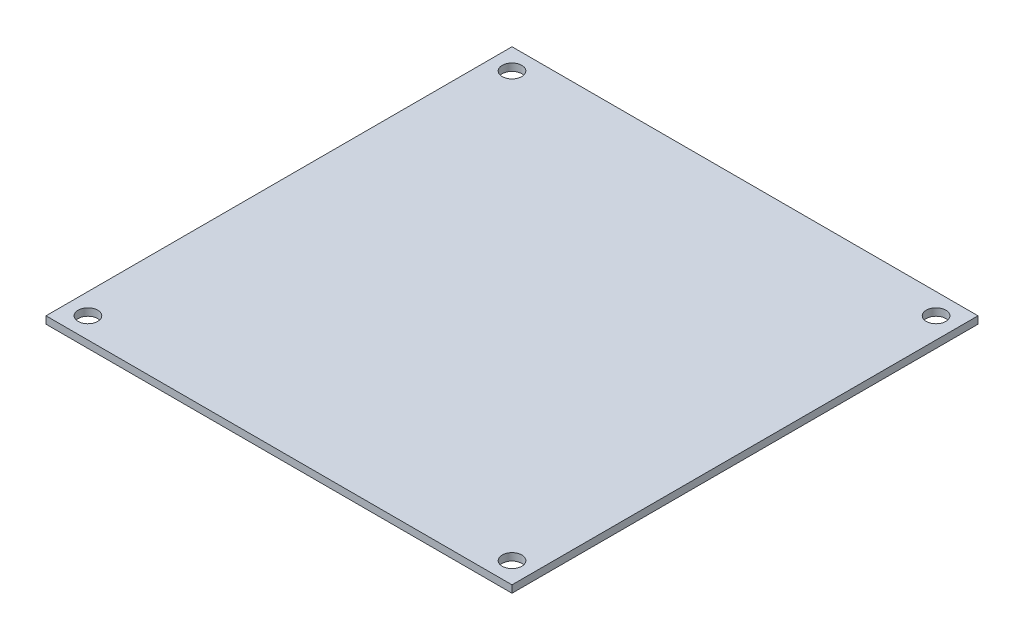
ISO-10303-21;
HEADER;
FILE_DESCRIPTION(('STEP AP214'),'2;1');
FILE_NAME('part.step','',(''),(''),'','','');
FILE_SCHEMA(('AUTOMOTIVE_DESIGN { 1 0 10303 214 1 1 1 1 }'));
ENDSEC;
DATA;
#1=APPLICATION_CONTEXT('core data for automotive mechanical design processes');
#2=APPLICATION_PROTOCOL_DEFINITION('international standard','automotive_design',2000,#1);
#3=PRODUCT_CONTEXT('',#1,'mechanical');
#4=PRODUCT('Part','Part','',(#3));
#5=PRODUCT_RELATED_PRODUCT_CATEGORY('part','',(#4));
#6=PRODUCT_DEFINITION_FORMATION('','',#4);
#7=PRODUCT_DEFINITION_CONTEXT('part definition',#1,'design');
#8=PRODUCT_DEFINITION('design','',#6,#7);
#9=PRODUCT_DEFINITION_SHAPE('','',#8);
#10=(LENGTH_UNIT() NAMED_UNIT(*) SI_UNIT(.MILLI.,.METRE.));
#11=(NAMED_UNIT(*) PLANE_ANGLE_UNIT() SI_UNIT($,.RADIAN.));
#12=(NAMED_UNIT(*) SI_UNIT($,.STERADIAN.) SOLID_ANGLE_UNIT());
#13=UNCERTAINTY_MEASURE_WITH_UNIT(LENGTH_MEASURE(1.E-05),#10,'distance_accuracy_value','');
#14=(GEOMETRIC_REPRESENTATION_CONTEXT(3) GLOBAL_UNCERTAINTY_ASSIGNED_CONTEXT((#13)) GLOBAL_UNIT_ASSIGNED_CONTEXT((#10,
#11,#12)) REPRESENTATION_CONTEXT('',''));
#15=CARTESIAN_POINT('',(0.,0.,0.));
#16=DIRECTION('',(0.,0.,1.));
#17=DIRECTION('',(1.,0.,0.));
#18=AXIS2_PLACEMENT_3D('',#15,#16,#17);
#19=CARTESIAN_POINT('',(0.,1.57,0.));
#20=DIRECTION('',(0.,-1.,0.));
#21=DIRECTION('',(0.,0.,-1.));
#22=AXIS2_PLACEMENT_3D('',#19,#20,#21);
#23=PLANE('',#22);
#24=DIRECTION('',(0.,0.,1.));
#25=VECTOR('',#24,1.);
#26=CARTESIAN_POINT('',(0.,1.57,0.));
#27=LINE('',#26,#25);
#28=CARTESIAN_POINT('',(0.,1.57,-100.));
#29=VERTEX_POINT('',#28);
#30=CARTESIAN_POINT('',(0.,1.57,0.));
#31=VERTEX_POINT('',#30);
#32=EDGE_CURVE('E85',#29,#31,#27,.T.);
#33=ORIENTED_EDGE('',*,*,#32,.T.);
#34=DIRECTION('',(1.,0.,0.));
#35=VECTOR('',#34,1.);
#36=CARTESIAN_POINT('',(0.,1.57,0.));
#37=LINE('',#36,#35);
#38=CARTESIAN_POINT('',(100.,1.57,0.));
#39=VERTEX_POINT('',#38);
#40=EDGE_CURVE('E80',#31,#39,#37,.T.);
#41=ORIENTED_EDGE('',*,*,#40,.T.);
#42=DIRECTION('',(0.,0.,-1.));
#43=VECTOR('',#42,1.);
#44=CARTESIAN_POINT('',(100.,1.57,0.));
#45=LINE('',#44,#43);
#46=CARTESIAN_POINT('',(100.,1.57,-100.));
#47=VERTEX_POINT('',#46);
#48=EDGE_CURVE('E83',#39,#47,#45,.T.);
#49=ORIENTED_EDGE('',*,*,#48,.T.);
#50=DIRECTION('',(-1.,0.,0.));
#51=VECTOR('',#50,1.);
#52=CARTESIAN_POINT('',(0.,1.57,-100.));
#53=LINE('',#52,#51);
#54=EDGE_CURVE('E50',#47,#29,#53,.T.);
#55=ORIENTED_EDGE('',*,*,#54,.T.);
#56=EDGE_LOOP('',(#33,#41,#49,#55));
#57=FACE_BOUND('',#56,.T.);
#58=CARTESIAN_POINT('',(4.5,1.57,-95.5));
#59=DIRECTION('',(0.,1.,0.));
#60=DIRECTION('',(0.,0.,1.));
#61=AXIS2_PLACEMENT_3D('',#58,#59,#60);
#62=CIRCLE('',#61,2.1);
#63=CARTESIAN_POINT('',(4.5,1.57,-93.4));
#64=VERTEX_POINT('',#63);
#65=EDGE_CURVE('E100',#64,#64,#62,.T.);
#66=ORIENTED_EDGE('',*,*,#65,.F.);
#67=EDGE_LOOP('',(#66));
#68=FACE_BOUND('',#67,.T.);
#69=CARTESIAN_POINT('',(95.5,1.57,-95.5));
#70=DIRECTION('',(0.,1.,0.));
#71=DIRECTION('',(0.,0.,1.));
#72=AXIS2_PLACEMENT_3D('',#69,#70,#71);
#73=CIRCLE('',#72,2.1);
#74=CARTESIAN_POINT('',(95.5,1.57,-93.4));
#75=VERTEX_POINT('',#74);
#76=EDGE_CURVE('E115',#75,#75,#73,.T.);
#77=ORIENTED_EDGE('',*,*,#76,.F.);
#78=EDGE_LOOP('',(#77));
#79=FACE_BOUND('',#78,.T.);
#80=CARTESIAN_POINT('',(95.5,1.57,-4.5));
#81=DIRECTION('',(0.,1.,0.));
#82=DIRECTION('',(0.,0.,1.));
#83=AXIS2_PLACEMENT_3D('',#80,#81,#82);
#84=CIRCLE('',#83,2.1);
#85=CARTESIAN_POINT('',(95.5,1.57,-2.4));
#86=VERTEX_POINT('',#85);
#87=EDGE_CURVE('E121',#86,#86,#84,.T.);
#88=ORIENTED_EDGE('',*,*,#87,.F.);
#89=EDGE_LOOP('',(#88));
#90=FACE_BOUND('',#89,.T.);
#91=CARTESIAN_POINT('',(4.5,1.57,-4.5));
#92=DIRECTION('',(0.,1.,0.));
#93=DIRECTION('',(0.,0.,1.));
#94=AXIS2_PLACEMENT_3D('',#91,#92,#93);
#95=CIRCLE('',#94,2.1);
#96=CARTESIAN_POINT('',(4.5,1.57,-2.4));
#97=VERTEX_POINT('',#96);
#98=EDGE_CURVE('E127',#97,#97,#95,.T.);
#99=ORIENTED_EDGE('',*,*,#98,.F.);
#100=EDGE_LOOP('',(#99));
#101=FACE_BOUND('',#100,.T.);
#102=ADVANCED_FACE('F33',(#57,#68,#79,#90,#101),#23,.F.);
#103=CARTESIAN_POINT('',(0.,0.,0.));
#104=DIRECTION('',(0.,-1.,0.));
#105=DIRECTION('',(0.,0.,-1.));
#106=AXIS2_PLACEMENT_3D('',#103,#104,#105);
#107=PLANE('',#106);
#108=CARTESIAN_POINT('',(95.5,0.,-4.5));
#109=DIRECTION('',(0.,1.,0.));
#110=DIRECTION('',(0.,0.,1.));
#111=AXIS2_PLACEMENT_3D('',#108,#109,#110);
#112=CIRCLE('',#111,2.1);
#113=CARTESIAN_POINT('',(95.5,0.,-2.4));
#114=VERTEX_POINT('',#113);
#115=EDGE_CURVE('E124',#114,#114,#112,.T.);
#116=ORIENTED_EDGE('',*,*,#115,.T.);
#117=EDGE_LOOP('',(#116));
#118=FACE_BOUND('',#117,.T.);
#119=CARTESIAN_POINT('',(4.5,0.,-95.5));
#120=DIRECTION('',(0.,1.,0.));
#121=DIRECTION('',(0.,0.,1.));
#122=AXIS2_PLACEMENT_3D('',#119,#120,#121);
#123=CIRCLE('',#122,2.1);
#124=CARTESIAN_POINT('',(4.5,0.,-93.4));
#125=VERTEX_POINT('',#124);
#126=EDGE_CURVE('E112',#125,#125,#123,.T.);
#127=ORIENTED_EDGE('',*,*,#126,.T.);
#128=EDGE_LOOP('',(#127));
#129=FACE_BOUND('',#128,.T.);
#130=DIRECTION('',(0.,0.,1.));
#131=VECTOR('',#130,1.);
#132=CARTESIAN_POINT('',(0.,0.,0.));
#133=LINE('',#132,#131);
#134=CARTESIAN_POINT('',(0.,0.,-100.));
#135=VERTEX_POINT('',#134);
#136=CARTESIAN_POINT('',(0.,0.,0.));
#137=VERTEX_POINT('',#136);
#138=EDGE_CURVE('E97',#135,#137,#133,.T.);
#139=ORIENTED_EDGE('',*,*,#138,.F.);
#140=DIRECTION('',(-1.,0.,0.));
#141=VECTOR('',#140,1.);
#142=CARTESIAN_POINT('',(0.,0.,-100.));
#143=LINE('',#142,#141);
#144=CARTESIAN_POINT('',(100.,0.,-100.));
#145=VERTEX_POINT('',#144);
#146=EDGE_CURVE('E73',#145,#135,#143,.T.);
#147=ORIENTED_EDGE('',*,*,#146,.F.);
#148=DIRECTION('',(0.,0.,-1.));
#149=VECTOR('',#148,1.);
#150=CARTESIAN_POINT('',(100.,0.,0.));
#151=LINE('',#150,#149);
#152=CARTESIAN_POINT('',(100.,0.,0.));
#153=VERTEX_POINT('',#152);
#154=EDGE_CURVE('E67',#153,#145,#151,.T.);
#155=ORIENTED_EDGE('',*,*,#154,.F.);
#156=DIRECTION('',(1.,0.,0.));
#157=VECTOR('',#156,1.);
#158=CARTESIAN_POINT('',(0.,0.,0.));
#159=LINE('',#158,#157);
#160=EDGE_CURVE('E89',#137,#153,#159,.T.);
#161=ORIENTED_EDGE('',*,*,#160,.F.);
#162=EDGE_LOOP('',(#139,#147,#155,#161));
#163=FACE_BOUND('',#162,.T.);
#164=CARTESIAN_POINT('',(95.5,0.,-95.5));
#165=DIRECTION('',(0.,1.,0.));
#166=DIRECTION('',(0.,0.,1.));
#167=AXIS2_PLACEMENT_3D('',#164,#165,#166);
#168=CIRCLE('',#167,2.1);
#169=CARTESIAN_POINT('',(95.5,0.,-93.4));
#170=VERTEX_POINT('',#169);
#171=EDGE_CURVE('E118',#170,#170,#168,.T.);
#172=ORIENTED_EDGE('',*,*,#171,.T.);
#173=EDGE_LOOP('',(#172));
#174=FACE_BOUND('',#173,.T.);
#175=CARTESIAN_POINT('',(4.5,0.,-4.5));
#176=DIRECTION('',(0.,1.,0.));
#177=DIRECTION('',(0.,0.,1.));
#178=AXIS2_PLACEMENT_3D('',#175,#176,#177);
#179=CIRCLE('',#178,2.1);
#180=CARTESIAN_POINT('',(4.5,0.,-2.4));
#181=VERTEX_POINT('',#180);
#182=EDGE_CURVE('E130',#181,#181,#179,.T.);
#183=ORIENTED_EDGE('',*,*,#182,.T.);
#184=EDGE_LOOP('',(#183));
#185=FACE_BOUND('',#184,.T.);
#186=ADVANCED_FACE('F108',(#118,#129,#163,#174,#185),#107,.T.);
#187=CARTESIAN_POINT('',(0.,1.57,0.));
#188=DIRECTION('',(1.,0.,0.));
#189=DIRECTION('',(0.,0.,-1.));
#190=AXIS2_PLACEMENT_3D('',#187,#188,#189);
#191=PLANE('',#190);
#192=ORIENTED_EDGE('',*,*,#138,.T.);
#193=DIRECTION('',(0.,-1.,0.));
#194=VECTOR('',#193,1.);
#195=CARTESIAN_POINT('',(0.,1.57,0.));
#196=LINE('',#195,#194);
#197=EDGE_CURVE('E11',#31,#137,#196,.T.);
#198=ORIENTED_EDGE('',*,*,#197,.F.);
#199=ORIENTED_EDGE('',*,*,#32,.F.);
#200=DIRECTION('',(0.,-1.,0.));
#201=VECTOR('',#200,1.);
#202=CARTESIAN_POINT('',(0.,1.57,-100.));
#203=LINE('',#202,#201);
#204=EDGE_CURVE('E93',#29,#135,#203,.T.);
#205=ORIENTED_EDGE('',*,*,#204,.T.);
#206=EDGE_LOOP('',(#192,#198,#199,#205));
#207=FACE_BOUND('',#206,.T.);
#208=ADVANCED_FACE('F35',(#207),#191,.F.);
#209=CARTESIAN_POINT('',(0.,1.57,0.));
#210=DIRECTION('',(0.,0.,-1.));
#211=DIRECTION('',(-1.,0.,0.));
#212=AXIS2_PLACEMENT_3D('',#209,#210,#211);
#213=PLANE('',#212);
#214=ORIENTED_EDGE('',*,*,#160,.T.);
#215=DIRECTION('',(0.,-1.,0.));
#216=VECTOR('',#215,1.);
#217=CARTESIAN_POINT('',(100.,1.57,0.));
#218=LINE('',#217,#216);
#219=EDGE_CURVE('E42',#39,#153,#218,.T.);
#220=ORIENTED_EDGE('',*,*,#219,.F.);
#221=ORIENTED_EDGE('',*,*,#40,.F.);
#222=ORIENTED_EDGE('',*,*,#197,.T.);
#223=EDGE_LOOP('',(#214,#220,#221,#222));
#224=FACE_BOUND('',#223,.T.);
#225=ADVANCED_FACE('F88',(#224),#213,.F.);
#226=CARTESIAN_POINT('',(100.,1.57,0.));
#227=DIRECTION('',(-1.,0.,0.));
#228=DIRECTION('',(0.,0.,1.));
#229=AXIS2_PLACEMENT_3D('',#226,#227,#228);
#230=PLANE('',#229);
#231=ORIENTED_EDGE('',*,*,#154,.T.);
#232=DIRECTION('',(0.,-1.,0.));
#233=VECTOR('',#232,1.);
#234=CARTESIAN_POINT('',(100.,1.57,-100.));
#235=LINE('',#234,#233);
#236=EDGE_CURVE('E90',#47,#145,#235,.T.);
#237=ORIENTED_EDGE('',*,*,#236,.F.);
#238=ORIENTED_EDGE('',*,*,#48,.F.);
#239=ORIENTED_EDGE('',*,*,#219,.T.);
#240=EDGE_LOOP('',(#231,#237,#238,#239));
#241=FACE_BOUND('',#240,.T.);
#242=ADVANCED_FACE('F91',(#241),#230,.F.);
#243=CARTESIAN_POINT('',(0.,1.57,-100.));
#244=DIRECTION('',(0.,0.,1.));
#245=DIRECTION('',(1.,0.,0.));
#246=AXIS2_PLACEMENT_3D('',#243,#244,#245);
#247=PLANE('',#246);
#248=ORIENTED_EDGE('',*,*,#146,.T.);
#249=ORIENTED_EDGE('',*,*,#204,.F.);
#250=ORIENTED_EDGE('',*,*,#54,.F.);
#251=ORIENTED_EDGE('',*,*,#236,.T.);
#252=EDGE_LOOP('',(#248,#249,#250,#251));
#253=FACE_BOUND('',#252,.T.);
#254=ADVANCED_FACE('F105',(#253),#247,.F.);
#255=CARTESIAN_POINT('',(4.5,1.57,-95.5));
#256=DIRECTION('',(0.,-1.,0.));
#257=DIRECTION('',(0.,0.,-1.));
#258=AXIS2_PLACEMENT_3D('',#255,#256,#257);
#259=CYLINDRICAL_SURFACE('',#258,2.1);
#260=ORIENTED_EDGE('',*,*,#65,.T.);
#261=EDGE_LOOP('',(#260));
#262=FACE_BOUND('',#261,.T.);
#263=ORIENTED_EDGE('',*,*,#126,.F.);
#264=EDGE_LOOP('',(#263));
#265=FACE_BOUND('',#264,.T.);
#266=ADVANCED_FACE('F147',(#262,#265),#259,.F.);
#267=CARTESIAN_POINT('',(95.5,1.57,-95.5));
#268=DIRECTION('',(0.,-1.,0.));
#269=DIRECTION('',(0.,0.,-1.));
#270=AXIS2_PLACEMENT_3D('',#267,#268,#269);
#271=CYLINDRICAL_SURFACE('',#270,2.1);
#272=ORIENTED_EDGE('',*,*,#76,.T.);
#273=EDGE_LOOP('',(#272));
#274=FACE_BOUND('',#273,.T.);
#275=ORIENTED_EDGE('',*,*,#171,.F.);
#276=EDGE_LOOP('',(#275));
#277=FACE_BOUND('',#276,.T.);
#278=ADVANCED_FACE('F193',(#274,#277),#271,.F.);
#279=CARTESIAN_POINT('',(95.5,1.57,-4.5));
#280=DIRECTION('',(0.,-1.,0.));
#281=DIRECTION('',(0.,0.,-1.));
#282=AXIS2_PLACEMENT_3D('',#279,#280,#281);
#283=CYLINDRICAL_SURFACE('',#282,2.1);
#284=ORIENTED_EDGE('',*,*,#87,.T.);
#285=EDGE_LOOP('',(#284));
#286=FACE_BOUND('',#285,.T.);
#287=ORIENTED_EDGE('',*,*,#115,.F.);
#288=EDGE_LOOP('',(#287));
#289=FACE_BOUND('',#288,.T.);
#290=ADVANCED_FACE('F201',(#286,#289),#283,.F.);
#291=CARTESIAN_POINT('',(4.5,1.57,-4.5));
#292=DIRECTION('',(0.,-1.,0.));
#293=DIRECTION('',(0.,0.,-1.));
#294=AXIS2_PLACEMENT_3D('',#291,#292,#293);
#295=CYLINDRICAL_SURFACE('',#294,2.1);
#296=ORIENTED_EDGE('',*,*,#98,.T.);
#297=EDGE_LOOP('',(#296));
#298=FACE_BOUND('',#297,.T.);
#299=ORIENTED_EDGE('',*,*,#182,.F.);
#300=EDGE_LOOP('',(#299));
#301=FACE_BOUND('',#300,.T.);
#302=ADVANCED_FACE('F136',(#298,#301),#295,.F.);
#303=CLOSED_SHELL('',(#102,#186,#208,#225,#242,#254,#266,#278,#290,#302));
#304=MANIFOLD_SOLID_BREP('B2',#303);
#305=ADVANCED_BREP_SHAPE_REPRESENTATION('',(#18,#304),#14);
#306=SHAPE_DEFINITION_REPRESENTATION(#9,#305);
ENDSEC;
END-ISO-10303-21;
